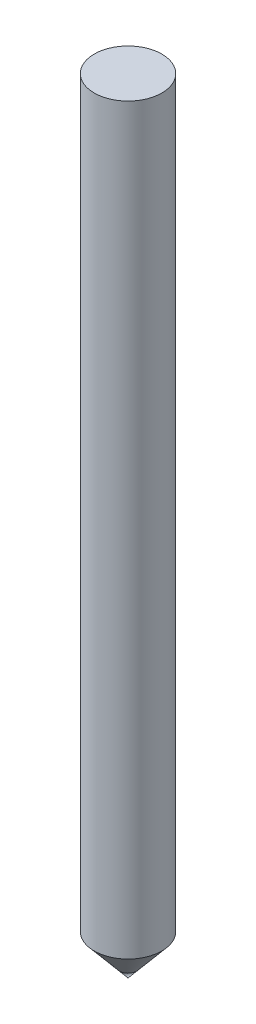
ISO-10303-21;
HEADER;
FILE_DESCRIPTION(('STEP AP214'),'2;1');
FILE_NAME('part.step','',(''),(''),'','','');
FILE_SCHEMA(('AUTOMOTIVE_DESIGN { 1 0 10303 214 1 1 1 1 }'));
ENDSEC;
DATA;
#1=APPLICATION_CONTEXT('core data for automotive mechanical design processes');
#2=APPLICATION_PROTOCOL_DEFINITION('international standard','automotive_design',2000,#1);
#3=PRODUCT_CONTEXT('',#1,'mechanical');
#4=PRODUCT('Part','Part','',(#3));
#5=PRODUCT_RELATED_PRODUCT_CATEGORY('part','',(#4));
#6=PRODUCT_DEFINITION_FORMATION('','',#4);
#7=PRODUCT_DEFINITION_CONTEXT('part definition',#1,'design');
#8=PRODUCT_DEFINITION('design','',#6,#7);
#9=PRODUCT_DEFINITION_SHAPE('','',#8);
#10=(LENGTH_UNIT() NAMED_UNIT(*) SI_UNIT(.MILLI.,.METRE.));
#11=(NAMED_UNIT(*) PLANE_ANGLE_UNIT() SI_UNIT($,.RADIAN.));
#12=(NAMED_UNIT(*) SI_UNIT($,.STERADIAN.) SOLID_ANGLE_UNIT());
#13=UNCERTAINTY_MEASURE_WITH_UNIT(LENGTH_MEASURE(1.E-05),#10,'distance_accuracy_value','');
#14=(GEOMETRIC_REPRESENTATION_CONTEXT(3) GLOBAL_UNCERTAINTY_ASSIGNED_CONTEXT((#13)) GLOBAL_UNIT_ASSIGNED_CONTEXT((#10,
#11,#12)) REPRESENTATION_CONTEXT('',''));
#15=CARTESIAN_POINT('',(0.,0.,0.));
#16=DIRECTION('',(0.,0.,1.));
#17=DIRECTION('',(1.,0.,0.));
#18=AXIS2_PLACEMENT_3D('',#15,#16,#17);
#19=CARTESIAN_POINT('',(0.,110.,0.));
#20=DIRECTION('',(0.,-1.,0.));
#21=DIRECTION('',(0.,0.,-1.));
#22=AXIS2_PLACEMENT_3D('',#19,#20,#21);
#23=CYLINDRICAL_SURFACE('',#22,5.);
#24=CARTESIAN_POINT('',(0.,110.,0.));
#25=DIRECTION('',(0.,1.,0.));
#26=DIRECTION('',(0.,0.,1.));
#27=AXIS2_PLACEMENT_3D('',#24,#25,#26);
#28=CIRCLE('',#27,5.);
#29=CARTESIAN_POINT('',(0.,110.,5.));
#30=VERTEX_POINT('',#29);
#31=EDGE_CURVE('E11',#30,#30,#28,.T.);
#32=ORIENTED_EDGE('',*,*,#31,.F.);
#33=EDGE_LOOP('',(#32));
#34=FACE_BOUND('',#33,.T.);
#35=CARTESIAN_POINT('',(0.,0.,0.));
#36=DIRECTION('',(0.,-1.,0.));
#37=DIRECTION('',(0.,0.,-1.));
#38=AXIS2_PLACEMENT_3D('',#35,#36,#37);
#39=CIRCLE('',#38,5.);
#40=CARTESIAN_POINT('',(0.,0.,-5.));
#41=VERTEX_POINT('',#40);
#42=EDGE_CURVE('E43',#41,#41,#39,.T.);
#43=ORIENTED_EDGE('',*,*,#42,.F.);
#44=EDGE_LOOP('',(#43));
#45=FACE_BOUND('',#44,.T.);
#46=ADVANCED_FACE('F37',(#34,#45),#23,.T.);
#47=CARTESIAN_POINT('',(0.,110.,0.));
#48=DIRECTION('',(0.,1.,0.));
#49=DIRECTION('',(0.,0.,1.));
#50=AXIS2_PLACEMENT_3D('',#47,#48,#49);
#51=PLANE('',#50);
#52=ORIENTED_EDGE('',*,*,#31,.T.);
#53=EDGE_LOOP('',(#52));
#54=FACE_BOUND('',#53,.T.);
#55=ADVANCED_FACE('F49',(#54),#51,.T.);
#56=CARTESIAN_POINT('',(0.,0.,0.));
#57=DIRECTION('',(0.,1.,0.));
#58=DIRECTION('',(0.,0.,-1.));
#59=AXIS2_PLACEMENT_3D('',#56,#57,#58);
#60=CONICAL_SURFACE('',#59,5.,0.698131700797732);
#61=CARTESIAN_POINT('',(0.,-5.95876796297104,0.));
#62=VERTEX_POINT('',#61);
#63=VERTEX_LOOP('',#62);
#64=FACE_BOUND('',#63,.T.);
#65=ORIENTED_EDGE('',*,*,#42,.T.);
#66=EDGE_LOOP('',(#65));
#67=FACE_BOUND('',#66,.T.);
#68=ADVANCED_FACE('F46',(#64,#67),#60,.T.);
#69=CLOSED_SHELL('',(#46,#55,#68));
#70=MANIFOLD_SOLID_BREP('B2',#69);
#71=ADVANCED_BREP_SHAPE_REPRESENTATION('',(#18,#70),#14);
#72=SHAPE_DEFINITION_REPRESENTATION(#9,#71);
ENDSEC;
END-ISO-10303-21;
